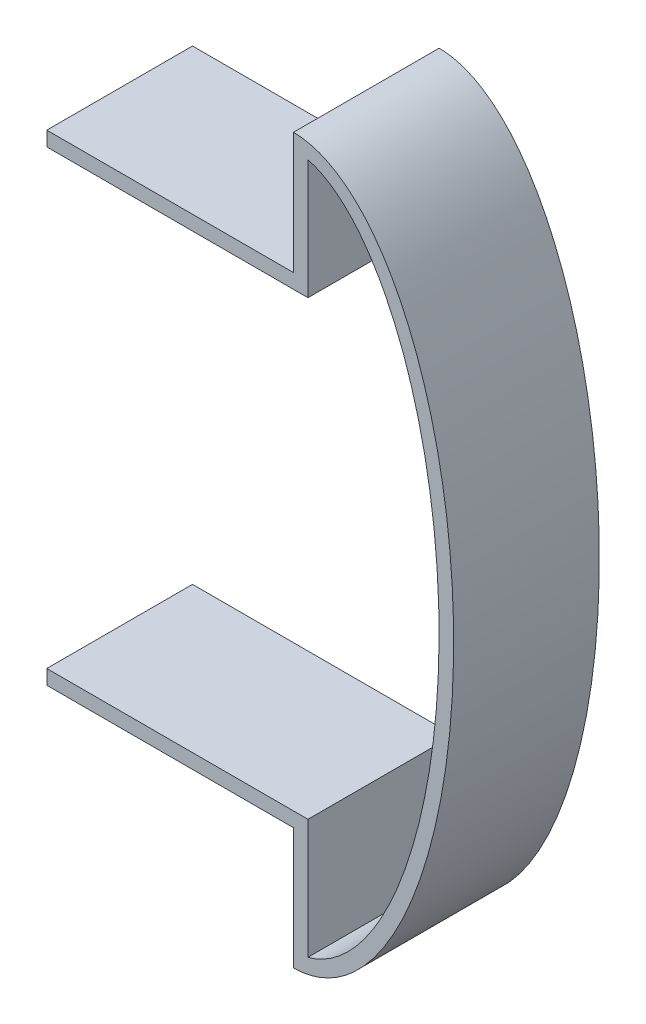
ISO-10303-21;
HEADER;
FILE_DESCRIPTION(('STEP AP214'),'2;1');
FILE_NAME('part.step','',(''),(''),'','','');
FILE_SCHEMA(('AUTOMOTIVE_DESIGN { 1 0 10303 214 1 1 1 1 }'));
ENDSEC;
DATA;
#1=APPLICATION_CONTEXT('core data for automotive mechanical design processes');
#2=APPLICATION_PROTOCOL_DEFINITION('international standard','automotive_design',2000,#1);
#3=PRODUCT_CONTEXT('',#1,'mechanical');
#4=PRODUCT('Part','Part','',(#3));
#5=PRODUCT_RELATED_PRODUCT_CATEGORY('part','',(#4));
#6=PRODUCT_DEFINITION_FORMATION('','',#4);
#7=PRODUCT_DEFINITION_CONTEXT('part definition',#1,'design');
#8=PRODUCT_DEFINITION('design','',#6,#7);
#9=PRODUCT_DEFINITION_SHAPE('','',#8);
#10=(LENGTH_UNIT() NAMED_UNIT(*) SI_UNIT(.MILLI.,.METRE.));
#11=(NAMED_UNIT(*) PLANE_ANGLE_UNIT() SI_UNIT($,.RADIAN.));
#12=(NAMED_UNIT(*) SI_UNIT($,.STERADIAN.) SOLID_ANGLE_UNIT());
#13=UNCERTAINTY_MEASURE_WITH_UNIT(LENGTH_MEASURE(1.E-05),#10,'distance_accuracy_value','');
#14=(GEOMETRIC_REPRESENTATION_CONTEXT(3) GLOBAL_UNCERTAINTY_ASSIGNED_CONTEXT((#13)) GLOBAL_UNIT_ASSIGNED_CONTEXT((#10,
#11,#12)) REPRESENTATION_CONTEXT('',''));
#15=CARTESIAN_POINT('',(0.,0.,0.));
#16=DIRECTION('',(0.,0.,1.));
#17=DIRECTION('',(1.,0.,0.));
#18=AXIS2_PLACEMENT_3D('',#15,#16,#17);
#19=CARTESIAN_POINT('',(126.221220654941,124.,30.));
#20=DIRECTION('',(0.,1.,0.));
#21=DIRECTION('',(-1.,0.,0.));
#22=AXIS2_PLACEMENT_3D('',#19,#20,#21);
#23=PLANE('',#22);
#24=DIRECTION('',(1.,0.,0.));
#25=VECTOR('',#24,1.);
#26=CARTESIAN_POINT('',(126.221220654941,124.,0.));
#27=LINE('',#26,#25);
#28=CARTESIAN_POINT('',(126.221220654941,124.,0.));
#29=VERTEX_POINT('',#28);
#30=CARTESIAN_POINT('',(177.,124.,0.));
#31=VERTEX_POINT('',#30);
#32=EDGE_CURVE('E174',#29,#31,#27,.T.);
#33=ORIENTED_EDGE('',*,*,#32,.F.);
#34=DIRECTION('',(0.,0.,-1.));
#35=VECTOR('',#34,1.);
#36=CARTESIAN_POINT('',(126.221220654941,124.,30.));
#37=LINE('',#36,#35);
#38=CARTESIAN_POINT('',(126.221220654941,124.,30.));
#39=VERTEX_POINT('',#38);
#40=EDGE_CURVE('E11',#39,#29,#37,.T.);
#41=ORIENTED_EDGE('',*,*,#40,.F.);
#42=DIRECTION('',(1.,0.,0.));
#43=VECTOR('',#42,1.);
#44=CARTESIAN_POINT('',(126.221220654941,124.,30.));
#45=LINE('',#44,#43);
#46=CARTESIAN_POINT('',(177.,124.,30.));
#47=VERTEX_POINT('',#46);
#48=EDGE_CURVE('E219',#39,#47,#45,.T.);
#49=ORIENTED_EDGE('',*,*,#48,.T.);
#50=DIRECTION('',(0.,0.,-1.));
#51=VECTOR('',#50,1.);
#52=CARTESIAN_POINT('',(177.,124.,30.));
#53=LINE('',#52,#51);
#54=EDGE_CURVE('E46',#47,#31,#53,.T.);
#55=ORIENTED_EDGE('',*,*,#54,.T.);
#56=EDGE_LOOP('',(#33,#41,#49,#55));
#57=FACE_BOUND('',#56,.T.);
#58=ADVANCED_FACE('F43',(#57),#23,.T.);
#59=CARTESIAN_POINT('',(126.221220654941,124.,30.));
#60=DIRECTION('',(1.,0.,0.));
#61=DIRECTION('',(0.,0.,-1.));
#62=AXIS2_PLACEMENT_3D('',#59,#60,#61);
#63=PLANE('',#62);
#64=DIRECTION('',(0.,-1.,0.));
#65=VECTOR('',#64,1.);
#66=CARTESIAN_POINT('',(126.221220654941,124.,0.));
#67=LINE('',#66,#65);
#68=CARTESIAN_POINT('',(126.221220654941,121.,0.));
#69=VERTEX_POINT('',#68);
#70=EDGE_CURVE('E101',#29,#69,#67,.T.);
#71=ORIENTED_EDGE('',*,*,#70,.T.);
#72=DIRECTION('',(0.,0.,-1.));
#73=VECTOR('',#72,1.);
#74=CARTESIAN_POINT('',(126.221220654941,121.,30.));
#75=LINE('',#74,#73);
#76=CARTESIAN_POINT('',(126.221220654941,121.,30.));
#77=VERTEX_POINT('',#76);
#78=EDGE_CURVE('E53',#77,#69,#75,.T.);
#79=ORIENTED_EDGE('',*,*,#78,.F.);
#80=DIRECTION('',(0.,-1.,0.));
#81=VECTOR('',#80,1.);
#82=CARTESIAN_POINT('',(126.221220654941,124.,30.));
#83=LINE('',#82,#81);
#84=EDGE_CURVE('E144',#39,#77,#83,.T.);
#85=ORIENTED_EDGE('',*,*,#84,.F.);
#86=ORIENTED_EDGE('',*,*,#40,.T.);
#87=EDGE_LOOP('',(#71,#79,#85,#86));
#88=FACE_BOUND('',#87,.T.);
#89=ADVANCED_FACE('F303',(#88),#63,.F.);
#90=CARTESIAN_POINT('',(126.221220654941,121.,30.));
#91=DIRECTION('',(0.,1.,0.));
#92=DIRECTION('',(0.,0.,1.));
#93=AXIS2_PLACEMENT_3D('',#90,#91,#92);
#94=PLANE('',#93);
#95=DIRECTION('',(1.,0.,0.));
#96=VECTOR('',#95,1.);
#97=CARTESIAN_POINT('',(126.221220654941,121.,0.));
#98=LINE('',#97,#96);
#99=CARTESIAN_POINT('',(180.,121.,0.));
#100=VERTEX_POINT('',#99);
#101=EDGE_CURVE('E152',#69,#100,#98,.T.);
#102=ORIENTED_EDGE('',*,*,#101,.T.);
#103=DIRECTION('',(0.,0.,-1.));
#104=VECTOR('',#103,1.);
#105=CARTESIAN_POINT('',(180.,121.,30.));
#106=LINE('',#105,#104);
#107=CARTESIAN_POINT('',(180.,121.,30.));
#108=VERTEX_POINT('',#107);
#109=EDGE_CURVE('E149',#108,#100,#106,.T.);
#110=ORIENTED_EDGE('',*,*,#109,.F.);
#111=DIRECTION('',(1.,0.,0.));
#112=VECTOR('',#111,1.);
#113=CARTESIAN_POINT('',(126.221220654941,121.,30.));
#114=LINE('',#113,#112);
#115=EDGE_CURVE('E137',#77,#108,#114,.T.);
#116=ORIENTED_EDGE('',*,*,#115,.F.);
#117=ORIENTED_EDGE('',*,*,#78,.T.);
#118=EDGE_LOOP('',(#102,#110,#116,#117));
#119=FACE_BOUND('',#118,.T.);
#120=ADVANCED_FACE('F150',(#119),#94,.F.);
#121=CARTESIAN_POINT('',(180.,121.,30.));
#122=DIRECTION('',(-1.,0.,0.));
#123=DIRECTION('',(0.,-1.,0.));
#124=AXIS2_PLACEMENT_3D('',#121,#122,#123);
#125=PLANE('',#124);
#126=DIRECTION('',(0.,1.,0.));
#127=VECTOR('',#126,1.);
#128=CARTESIAN_POINT('',(180.,121.,0.));
#129=LINE('',#128,#127);
#130=CARTESIAN_POINT('',(180.,145.612681948181,0.));
#131=VERTEX_POINT('',#130);
#132=EDGE_CURVE('E210',#100,#131,#129,.T.);
#133=ORIENTED_EDGE('',*,*,#132,.T.);
#134=DIRECTION('',(0.,0.,-1.));
#135=VECTOR('',#134,1.);
#136=CARTESIAN_POINT('',(180.,145.612681948181,30.));
#137=LINE('',#136,#135);
#138=CARTESIAN_POINT('',(180.,145.612681948181,30.));
#139=VERTEX_POINT('',#138);
#140=EDGE_CURVE('E156',#139,#131,#137,.T.);
#141=ORIENTED_EDGE('',*,*,#140,.F.);
#142=DIRECTION('',(0.,1.,0.));
#143=VECTOR('',#142,1.);
#144=CARTESIAN_POINT('',(180.,121.,30.));
#145=LINE('',#144,#143);
#146=EDGE_CURVE('E142',#108,#139,#145,.T.);
#147=ORIENTED_EDGE('',*,*,#146,.F.);
#148=ORIENTED_EDGE('',*,*,#109,.T.);
#149=EDGE_LOOP('',(#133,#141,#147,#148));
#150=FACE_BOUND('',#149,.T.);
#151=ADVANCED_FACE('F158',(#150),#125,.F.);
#152=CARTESIAN_POINT('',(180.,145.612681948181,30.));
#153=CARTESIAN_POINT('',(180.410546956581,145.506670856105,30.));
#154=CARTESIAN_POINT('',(181.209404390501,145.258447166253,30.));
#155=CARTESIAN_POINT('',(182.850309347034,144.577664533819,30.));
#156=CARTESIAN_POINT('',(184.920880241753,143.385146039545,30.));
#157=CARTESIAN_POINT('',(187.428616860582,141.377794933334,30.));
#158=CARTESIAN_POINT('',(190.742052841564,137.929305695173,30.));
#159=CARTESIAN_POINT('',(194.723191139202,132.197775888486,30.));
#160=CARTESIAN_POINT('',(198.959104522561,123.278596787256,30.));
#161=CARTESIAN_POINT('',(202.448319453828,112.648593555849,30.));
#162=CARTESIAN_POINT('',(205.909698127742,96.7054297220197,30.));
#163=CARTESIAN_POINT('',(207.726867914839,74.4999999999998,30.));
#164=CARTESIAN_POINT('',(205.909698127741,52.2945702779801,30.));
#165=CARTESIAN_POINT('',(202.448319453828,36.3514064441509,30.));
#166=CARTESIAN_POINT('',(198.959104522561,25.7214032127441,30.));
#167=CARTESIAN_POINT('',(194.723191139202,16.8022241115141,30.));
#168=CARTESIAN_POINT('',(190.742052841564,11.0706943048268,30.));
#169=CARTESIAN_POINT('',(187.428616860582,7.6222050666661,30.));
#170=CARTESIAN_POINT('',(184.920880241753,5.61485396045475,30.));
#171=CARTESIAN_POINT('',(182.850309347034,4.4223354661814,30.));
#172=CARTESIAN_POINT('',(181.209404390501,3.74155283374672,30.));
#173=CARTESIAN_POINT('',(180.410546956581,3.49332914389452,30.));
#174=CARTESIAN_POINT('',(180.,3.3873180518188,30.));
#175=B_SPLINE_CURVE_WITH_KNOTS('',3,(#152,#153,#154,#155,#156,#157,#158,#159,#160,#161,#162,
#163,#164,#165,#166,#167,#168,#169,#170,#171,#172,#173,#174),.UNSPECIFIED.,.F.,.F.,(4,1,1,1,1,1,
1,1,1,1,1,1,1,1,1,1,1,1,1,1,4),(3.25547670202281,3.30100521072162,3.34653371942043,
3.43759073681804,3.52864775421566,3.61970477161328,3.80181880640851,3.98393284120375,
4.16604687599898,4.34816091079422,4.71238898038469,5.07661704997516,5.25873108477039,
5.44084511956563,5.62295915436086,5.8050731891561,5.89613020655371,5.98718722395133,
6.07824424134895,6.12377275004776,6.16930125874657),.UNSPECIFIED.);
#176=DIRECTION('',(0.,0.,-1.));
#177=VECTOR('',#176,1.);
#178=SURFACE_OF_LINEAR_EXTRUSION('',#175,#177);
#179=CARTESIAN_POINT('',(180.,145.612681948181,0.));
#180=CARTESIAN_POINT('',(180.410546956581,145.506670856105,0.));
#181=CARTESIAN_POINT('',(181.209404390501,145.258447166253,0.));
#182=CARTESIAN_POINT('',(182.850309347034,144.577664533819,0.));
#183=CARTESIAN_POINT('',(184.920880241753,143.385146039545,0.));
#184=CARTESIAN_POINT('',(187.428616860582,141.377794933334,0.));
#185=CARTESIAN_POINT('',(190.742052841564,137.929305695173,0.));
#186=CARTESIAN_POINT('',(194.723191139202,132.197775888486,0.));
#187=CARTESIAN_POINT('',(198.959104522561,123.278596787256,0.));
#188=CARTESIAN_POINT('',(202.448319453828,112.648593555849,0.));
#189=CARTESIAN_POINT('',(205.909698127742,96.7054297220197,0.));
#190=CARTESIAN_POINT('',(207.726867914839,74.4999999999998,0.));
#191=CARTESIAN_POINT('',(205.909698127741,52.2945702779801,0.));
#192=CARTESIAN_POINT('',(202.448319453828,36.3514064441509,0.));
#193=CARTESIAN_POINT('',(198.959104522561,25.7214032127441,0.));
#194=CARTESIAN_POINT('',(194.723191139202,16.8022241115141,0.));
#195=CARTESIAN_POINT('',(190.742052841564,11.0706943048268,0.));
#196=CARTESIAN_POINT('',(187.428616860582,7.6222050666661,0.));
#197=CARTESIAN_POINT('',(184.920880241753,5.61485396045475,0.));
#198=CARTESIAN_POINT('',(182.850309347034,4.4223354661814,0.));
#199=CARTESIAN_POINT('',(181.209404390501,3.74155283374672,0.));
#200=CARTESIAN_POINT('',(180.410546956581,3.49332914389452,0.));
#201=CARTESIAN_POINT('',(180.,3.3873180518188,0.));
#202=B_SPLINE_CURVE_WITH_KNOTS('',3,(#179,#180,#181,#182,#183,#184,#185,#186,#187,#188,#189,
#190,#191,#192,#193,#194,#195,#196,#197,#198,#199,#200,#201),.UNSPECIFIED.,.F.,.F.,(4,1,1,1,1,1,
1,1,1,1,1,1,1,1,1,1,1,1,1,1,4),(3.25547670202281,3.30100521072162,3.34653371942043,
3.43759073681804,3.52864775421566,3.61970477161328,3.80181880640851,3.98393284120375,
4.16604687599898,4.34816091079422,4.71238898038469,5.07661704997516,5.25873108477039,
5.44084511956563,5.62295915436086,5.8050731891561,5.89613020655371,5.98718722395133,
6.07824424134895,6.12377275004776,6.16930125874657),.UNSPECIFIED.);
#203=CARTESIAN_POINT('',(180.,3.3873180518188,0.));
#204=VERTEX_POINT('',#203);
#205=EDGE_CURVE('E205',#131,#204,#202,.T.);
#206=ORIENTED_EDGE('',*,*,#205,.T.);
#207=DIRECTION('',(0.,0.,-1.));
#208=VECTOR('',#207,1.);
#209=CARTESIAN_POINT('',(180.,3.3873180518188,30.));
#210=LINE('',#209,#208);
#211=CARTESIAN_POINT('',(180.,3.3873180518188,30.));
#212=VERTEX_POINT('',#211);
#213=EDGE_CURVE('E225',#212,#204,#210,.T.);
#214=ORIENTED_EDGE('',*,*,#213,.F.);
#215=EDGE_CURVE('E162',#139,#212,#175,.T.);
#216=ORIENTED_EDGE('',*,*,#215,.F.);
#217=ORIENTED_EDGE('',*,*,#140,.T.);
#218=EDGE_LOOP('',(#206,#214,#216,#217));
#219=FACE_BOUND('',#218,.T.);
#220=ADVANCED_FACE('F255',(#219),#178,.F.);
#221=CARTESIAN_POINT('',(180.,3.3873180518188,30.));
#222=DIRECTION('',(-1.,0.,0.));
#223=DIRECTION('',(0.,0.,1.));
#224=AXIS2_PLACEMENT_3D('',#221,#222,#223);
#225=PLANE('',#224);
#226=DIRECTION('',(0.,1.,0.));
#227=VECTOR('',#226,1.);
#228=CARTESIAN_POINT('',(180.,3.3873180518188,0.));
#229=LINE('',#228,#227);
#230=CARTESIAN_POINT('',(180.,28.,0.));
#231=VERTEX_POINT('',#230);
#232=EDGE_CURVE('E202',#204,#231,#229,.T.);
#233=ORIENTED_EDGE('',*,*,#232,.T.);
#234=DIRECTION('',(0.,0.,-1.));
#235=VECTOR('',#234,1.);
#236=CARTESIAN_POINT('',(180.,28.,30.));
#237=LINE('',#236,#235);
#238=CARTESIAN_POINT('',(180.,28.,30.));
#239=VERTEX_POINT('',#238);
#240=EDGE_CURVE('E229',#239,#231,#237,.T.);
#241=ORIENTED_EDGE('',*,*,#240,.F.);
#242=DIRECTION('',(0.,1.,0.));
#243=VECTOR('',#242,1.);
#244=CARTESIAN_POINT('',(180.,3.3873180518188,30.));
#245=LINE('',#244,#243);
#246=EDGE_CURVE('E165',#212,#239,#245,.T.);
#247=ORIENTED_EDGE('',*,*,#246,.F.);
#248=ORIENTED_EDGE('',*,*,#213,.T.);
#249=EDGE_LOOP('',(#233,#241,#247,#248));
#250=FACE_BOUND('',#249,.T.);
#251=ADVANCED_FACE('F265',(#250),#225,.F.);
#252=CARTESIAN_POINT('',(180.,28.,30.));
#253=DIRECTION('',(0.,-1.,0.));
#254=DIRECTION('',(0.,0.,-1.));
#255=AXIS2_PLACEMENT_3D('',#252,#253,#254);
#256=PLANE('',#255);
#257=DIRECTION('',(-1.,0.,0.));
#258=VECTOR('',#257,1.);
#259=CARTESIAN_POINT('',(180.,28.,0.));
#260=LINE('',#259,#258);
#261=CARTESIAN_POINT('',(126.221220654941,28.,0.));
#262=VERTEX_POINT('',#261);
#263=EDGE_CURVE('E198',#231,#262,#260,.T.);
#264=ORIENTED_EDGE('',*,*,#263,.T.);
#265=DIRECTION('',(0.,0.,-1.));
#266=VECTOR('',#265,1.);
#267=CARTESIAN_POINT('',(126.221220654941,28.,30.));
#268=LINE('',#267,#266);
#269=CARTESIAN_POINT('',(126.221220654941,28.,30.));
#270=VERTEX_POINT('',#269);
#271=EDGE_CURVE('E233',#270,#262,#268,.T.);
#272=ORIENTED_EDGE('',*,*,#271,.F.);
#273=DIRECTION('',(-1.,0.,0.));
#274=VECTOR('',#273,1.);
#275=CARTESIAN_POINT('',(180.,28.,30.));
#276=LINE('',#275,#274);
#277=EDGE_CURVE('E261',#239,#270,#276,.T.);
#278=ORIENTED_EDGE('',*,*,#277,.F.);
#279=ORIENTED_EDGE('',*,*,#240,.T.);
#280=EDGE_LOOP('',(#264,#272,#278,#279));
#281=FACE_BOUND('',#280,.T.);
#282=ADVANCED_FACE('F268',(#281),#256,.F.);
#283=CARTESIAN_POINT('',(126.221220654941,25.,30.));
#284=DIRECTION('',(-1.,0.,0.));
#285=DIRECTION('',(0.,0.,1.));
#286=AXIS2_PLACEMENT_3D('',#283,#284,#285);
#287=PLANE('',#286);
#288=DIRECTION('',(0.,1.,0.));
#289=VECTOR('',#288,1.);
#290=CARTESIAN_POINT('',(126.221220654941,25.,0.));
#291=LINE('',#290,#289);
#292=CARTESIAN_POINT('',(126.221220654941,25.,0.));
#293=VERTEX_POINT('',#292);
#294=EDGE_CURVE('E194',#293,#262,#291,.T.);
#295=ORIENTED_EDGE('',*,*,#294,.F.);
#296=DIRECTION('',(0.,0.,-1.));
#297=VECTOR('',#296,1.);
#298=CARTESIAN_POINT('',(126.221220654941,25.,30.));
#299=LINE('',#298,#297);
#300=CARTESIAN_POINT('',(126.221220654941,25.,30.));
#301=VERTEX_POINT('',#300);
#302=EDGE_CURVE('E236',#301,#293,#299,.T.);
#303=ORIENTED_EDGE('',*,*,#302,.F.);
#304=DIRECTION('',(0.,1.,0.));
#305=VECTOR('',#304,1.);
#306=CARTESIAN_POINT('',(126.221220654941,25.,30.));
#307=LINE('',#306,#305);
#308=EDGE_CURVE('E271',#301,#270,#307,.T.);
#309=ORIENTED_EDGE('',*,*,#308,.T.);
#310=ORIENTED_EDGE('',*,*,#271,.T.);
#311=EDGE_LOOP('',(#295,#303,#309,#310));
#312=FACE_BOUND('',#311,.T.);
#313=ADVANCED_FACE('F322',(#312),#287,.T.);
#314=CARTESIAN_POINT('',(177.,25.,30.));
#315=DIRECTION('',(0.,-1.,0.));
#316=DIRECTION('',(0.,0.,-1.));
#317=AXIS2_PLACEMENT_3D('',#314,#315,#316);
#318=PLANE('',#317);
#319=DIRECTION('',(-1.,0.,0.));
#320=VECTOR('',#319,1.);
#321=CARTESIAN_POINT('',(177.,25.,0.));
#322=LINE('',#321,#320);
#323=CARTESIAN_POINT('',(177.,25.,0.));
#324=VERTEX_POINT('',#323);
#325=EDGE_CURVE('E190',#324,#293,#322,.T.);
#326=ORIENTED_EDGE('',*,*,#325,.F.);
#327=DIRECTION('',(0.,0.,-1.));
#328=VECTOR('',#327,1.);
#329=CARTESIAN_POINT('',(177.,25.,30.));
#330=LINE('',#329,#328);
#331=CARTESIAN_POINT('',(177.,25.,30.));
#332=VERTEX_POINT('',#331);
#333=EDGE_CURVE('E239',#332,#324,#330,.T.);
#334=ORIENTED_EDGE('',*,*,#333,.F.);
#335=DIRECTION('',(-1.,0.,0.));
#336=VECTOR('',#335,1.);
#337=CARTESIAN_POINT('',(177.,25.,30.));
#338=LINE('',#337,#336);
#339=EDGE_CURVE('E274',#332,#301,#338,.T.);
#340=ORIENTED_EDGE('',*,*,#339,.T.);
#341=ORIENTED_EDGE('',*,*,#302,.T.);
#342=EDGE_LOOP('',(#326,#334,#340,#341));
#343=FACE_BOUND('',#342,.T.);
#344=ADVANCED_FACE('F324',(#343),#318,.T.);
#345=CARTESIAN_POINT('',(177.,0.,30.));
#346=DIRECTION('',(-1.,0.,0.));
#347=DIRECTION('',(0.,-1.,0.));
#348=AXIS2_PLACEMENT_3D('',#345,#346,#347);
#349=PLANE('',#348);
#350=DIRECTION('',(0.,1.,0.));
#351=VECTOR('',#350,1.);
#352=CARTESIAN_POINT('',(177.,0.,0.));
#353=LINE('',#352,#351);
#354=CARTESIAN_POINT('',(177.,0.,0.));
#355=VERTEX_POINT('',#354);
#356=EDGE_CURVE('E186',#355,#324,#353,.T.);
#357=ORIENTED_EDGE('',*,*,#356,.F.);
#358=DIRECTION('',(0.,0.,-1.));
#359=VECTOR('',#358,1.);
#360=CARTESIAN_POINT('',(177.,0.,30.));
#361=LINE('',#360,#359);
#362=CARTESIAN_POINT('',(177.,0.,30.));
#363=VERTEX_POINT('',#362);
#364=EDGE_CURVE('E242',#363,#355,#361,.T.);
#365=ORIENTED_EDGE('',*,*,#364,.F.);
#366=DIRECTION('',(0.,1.,0.));
#367=VECTOR('',#366,1.);
#368=CARTESIAN_POINT('',(177.,0.,30.));
#369=LINE('',#368,#367);
#370=EDGE_CURVE('E280',#363,#332,#369,.T.);
#371=ORIENTED_EDGE('',*,*,#370,.T.);
#372=ORIENTED_EDGE('',*,*,#333,.T.);
#373=EDGE_LOOP('',(#357,#365,#371,#372));
#374=FACE_BOUND('',#373,.T.);
#375=ADVANCED_FACE('F294',(#374),#349,.T.);
#376=CARTESIAN_POINT('',(177.,74.5,30.));
#377=DIRECTION('',(0.,0.,1.));
#378=DIRECTION('',(0.,1.,0.));
#379=AXIS2_PLACEMENT_3D('',#376,#377,#378);
#380=ELLIPSE('',#379,74.5,33.);
#381=DIRECTION('',(0.,0.,-1.));
#382=VECTOR('',#381,1.);
#383=SURFACE_OF_LINEAR_EXTRUSION('',#380,#382);
#384=CARTESIAN_POINT('',(177.,74.5,0.));
#385=DIRECTION('',(0.,0.,1.));
#386=DIRECTION('',(0.,1.,0.));
#387=AXIS2_PLACEMENT_3D('',#384,#385,#386);
#388=ELLIPSE('',#387,74.5,33.);
#389=CARTESIAN_POINT('',(177.,149.,0.));
#390=VERTEX_POINT('',#389);
#391=EDGE_CURVE('E182',#355,#390,#388,.T.);
#392=ORIENTED_EDGE('',*,*,#391,.T.);
#393=DIRECTION('',(0.,0.,-1.));
#394=VECTOR('',#393,1.);
#395=CARTESIAN_POINT('',(177.,149.,30.));
#396=LINE('',#395,#394);
#397=CARTESIAN_POINT('',(177.,149.,30.));
#398=VERTEX_POINT('',#397);
#399=EDGE_CURVE('E244',#398,#390,#396,.T.);
#400=ORIENTED_EDGE('',*,*,#399,.F.);
#401=EDGE_CURVE('E284',#363,#398,#380,.T.);
#402=ORIENTED_EDGE('',*,*,#401,.F.);
#403=ORIENTED_EDGE('',*,*,#364,.T.);
#404=EDGE_LOOP('',(#392,#400,#402,#403));
#405=FACE_BOUND('',#404,.T.);
#406=ADVANCED_FACE('F291',(#405),#383,.F.);
#407=CARTESIAN_POINT('',(177.,124.,30.));
#408=DIRECTION('',(-1.,0.,0.));
#409=DIRECTION('',(0.,-1.,0.));
#410=AXIS2_PLACEMENT_3D('',#407,#408,#409);
#411=PLANE('',#410);
#412=DIRECTION('',(0.,1.,0.));
#413=VECTOR('',#412,1.);
#414=CARTESIAN_POINT('',(177.,124.,0.));
#415=LINE('',#414,#413);
#416=EDGE_CURVE('E178',#31,#390,#415,.T.);
#417=ORIENTED_EDGE('',*,*,#416,.F.);
#418=ORIENTED_EDGE('',*,*,#54,.F.);
#419=DIRECTION('',(0.,1.,0.));
#420=VECTOR('',#419,1.);
#421=CARTESIAN_POINT('',(177.,124.,30.));
#422=LINE('',#421,#420);
#423=EDGE_CURVE('E288',#47,#398,#422,.T.);
#424=ORIENTED_EDGE('',*,*,#423,.T.);
#425=ORIENTED_EDGE('',*,*,#399,.T.);
#426=EDGE_LOOP('',(#417,#418,#424,#425));
#427=FACE_BOUND('',#426,.T.);
#428=ADVANCED_FACE('F248',(#427),#411,.T.);
#429=CARTESIAN_POINT('',(177.,74.5,30.));
#430=DIRECTION('',(0.,0.,1.));
#431=DIRECTION('',(1.,0.,0.));
#432=AXIS2_PLACEMENT_3D('',#429,#430,#431);
#433=PLANE('',#432);
#434=ORIENTED_EDGE('',*,*,#48,.F.);
#435=ORIENTED_EDGE('',*,*,#84,.T.);
#436=ORIENTED_EDGE('',*,*,#115,.T.);
#437=ORIENTED_EDGE('',*,*,#146,.T.);
#438=ORIENTED_EDGE('',*,*,#215,.T.);
#439=ORIENTED_EDGE('',*,*,#246,.T.);
#440=ORIENTED_EDGE('',*,*,#277,.T.);
#441=ORIENTED_EDGE('',*,*,#308,.F.);
#442=ORIENTED_EDGE('',*,*,#339,.F.);
#443=ORIENTED_EDGE('',*,*,#370,.F.);
#444=ORIENTED_EDGE('',*,*,#401,.T.);
#445=ORIENTED_EDGE('',*,*,#423,.F.);
#446=EDGE_LOOP('',(#434,#435,#436,#437,#438,#439,#440,#441,#442,#443,#444,#445));
#447=FACE_BOUND('',#446,.T.);
#448=ADVANCED_FACE('F140',(#447),#433,.T.);
#449=CARTESIAN_POINT('',(177.,74.5,0.));
#450=DIRECTION('',(0.,0.,1.));
#451=DIRECTION('',(1.,0.,0.));
#452=AXIS2_PLACEMENT_3D('',#449,#450,#451);
#453=PLANE('',#452);
#454=ORIENTED_EDGE('',*,*,#32,.T.);
#455=ORIENTED_EDGE('',*,*,#416,.T.);
#456=ORIENTED_EDGE('',*,*,#391,.F.);
#457=ORIENTED_EDGE('',*,*,#356,.T.);
#458=ORIENTED_EDGE('',*,*,#325,.T.);
#459=ORIENTED_EDGE('',*,*,#294,.T.);
#460=ORIENTED_EDGE('',*,*,#263,.F.);
#461=ORIENTED_EDGE('',*,*,#232,.F.);
#462=ORIENTED_EDGE('',*,*,#205,.F.);
#463=ORIENTED_EDGE('',*,*,#132,.F.);
#464=ORIENTED_EDGE('',*,*,#101,.F.);
#465=ORIENTED_EDGE('',*,*,#70,.F.);
#466=EDGE_LOOP('',(#454,#455,#456,#457,#458,#459,#460,#461,#462,#463,#464,#465));
#467=FACE_BOUND('',#466,.T.);
#468=ADVANCED_FACE('F251',(#467),#453,.F.);
#469=CLOSED_SHELL('',(#58,#89,#120,#151,#220,#251,#282,#313,#344,#375,#406,#428,#448,#468));
#470=MANIFOLD_SOLID_BREP('B2',#469);
#471=ADVANCED_BREP_SHAPE_REPRESENTATION('',(#18,#470),#14);
#472=SHAPE_DEFINITION_REPRESENTATION(#9,#471);
ENDSEC;
END-ISO-10303-21;
